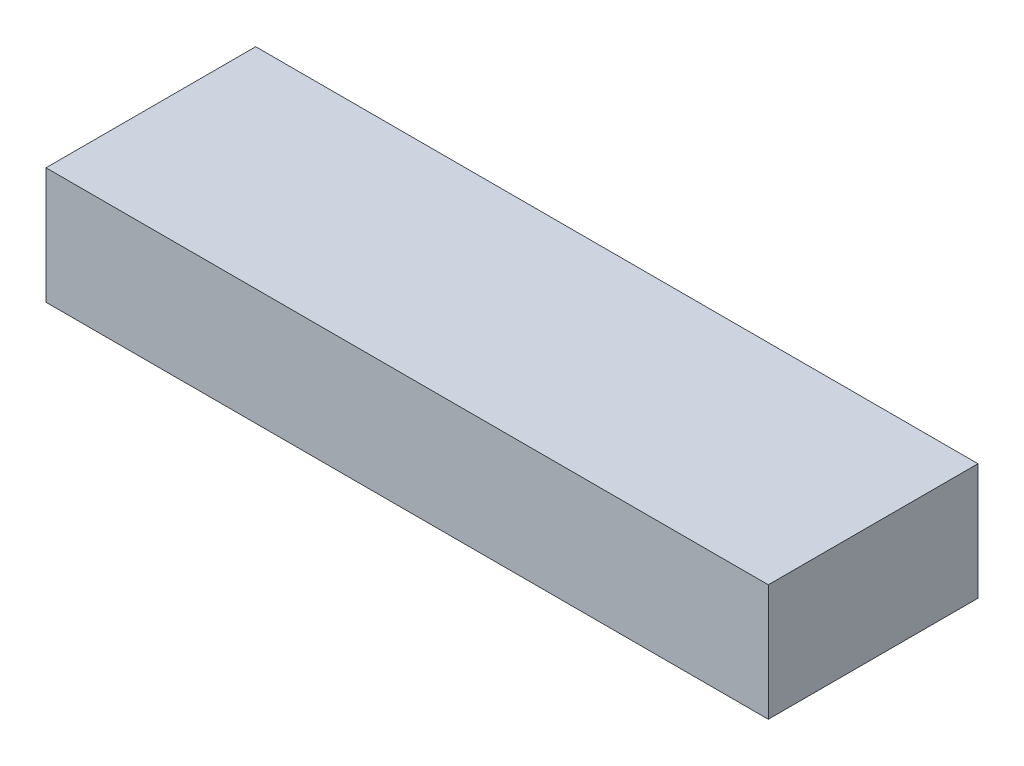
ISO-10303-21;
HEADER;
FILE_DESCRIPTION(('STEP AP214'),'2;1');
FILE_NAME('part.step','',(''),(''),'','','');
FILE_SCHEMA(('AUTOMOTIVE_DESIGN { 1 0 10303 214 1 1 1 1 }'));
ENDSEC;
DATA;
#1=APPLICATION_CONTEXT('core data for automotive mechanical design processes');
#2=APPLICATION_PROTOCOL_DEFINITION('international standard','automotive_design',2000,#1);
#3=PRODUCT_CONTEXT('',#1,'mechanical');
#4=PRODUCT('Part','Part','',(#3));
#5=PRODUCT_RELATED_PRODUCT_CATEGORY('part','',(#4));
#6=PRODUCT_DEFINITION_FORMATION('','',#4);
#7=PRODUCT_DEFINITION_CONTEXT('part definition',#1,'design');
#8=PRODUCT_DEFINITION('design','',#6,#7);
#9=PRODUCT_DEFINITION_SHAPE('','',#8);
#10=(LENGTH_UNIT() NAMED_UNIT(*) SI_UNIT(.MILLI.,.METRE.));
#11=(NAMED_UNIT(*) PLANE_ANGLE_UNIT() SI_UNIT($,.RADIAN.));
#12=(NAMED_UNIT(*) SI_UNIT($,.STERADIAN.) SOLID_ANGLE_UNIT());
#13=UNCERTAINTY_MEASURE_WITH_UNIT(LENGTH_MEASURE(1.E-05),#10,'distance_accuracy_value','');
#14=(GEOMETRIC_REPRESENTATION_CONTEXT(3) GLOBAL_UNCERTAINTY_ASSIGNED_CONTEXT((#13)) GLOBAL_UNIT_ASSIGNED_CONTEXT((#10,
#11,#12)) REPRESENTATION_CONTEXT('',''));
#15=CARTESIAN_POINT('',(0.,0.,0.));
#16=DIRECTION('',(0.,0.,1.));
#17=DIRECTION('',(1.,0.,0.));
#18=AXIS2_PLACEMENT_3D('',#15,#16,#17);
#19=CARTESIAN_POINT('',(77.5,25.,22.5));
#20=DIRECTION('',(-1.,0.,0.));
#21=DIRECTION('',(0.,0.,1.));
#22=AXIS2_PLACEMENT_3D('',#19,#20,#21);
#23=PLANE('',#22);
#24=DIRECTION('',(0.,0.,-1.));
#25=VECTOR('',#24,1.);
#26=CARTESIAN_POINT('',(77.5,0.,22.5));
#27=LINE('',#26,#25);
#28=CARTESIAN_POINT('',(77.5,0.,22.5));
#29=VERTEX_POINT('',#28);
#30=CARTESIAN_POINT('',(77.5,0.,-22.5));
#31=VERTEX_POINT('',#30);
#32=EDGE_CURVE('E106',#29,#31,#27,.T.);
#33=ORIENTED_EDGE('',*,*,#32,.T.);
#34=DIRECTION('',(0.,-1.,0.));
#35=VECTOR('',#34,1.);
#36=CARTESIAN_POINT('',(77.5,25.,-22.5));
#37=LINE('',#36,#35);
#38=CARTESIAN_POINT('',(77.5,25.,-22.5));
#39=VERTEX_POINT('',#38);
#40=EDGE_CURVE('E11',#39,#31,#37,.T.);
#41=ORIENTED_EDGE('',*,*,#40,.F.);
#42=DIRECTION('',(0.,0.,-1.));
#43=VECTOR('',#42,1.);
#44=CARTESIAN_POINT('',(77.5,25.,22.5));
#45=LINE('',#44,#43);
#46=CARTESIAN_POINT('',(77.5,25.,22.5));
#47=VERTEX_POINT('',#46);
#48=EDGE_CURVE('E94',#47,#39,#45,.T.);
#49=ORIENTED_EDGE('',*,*,#48,.F.);
#50=DIRECTION('',(0.,-1.,0.));
#51=VECTOR('',#50,1.);
#52=CARTESIAN_POINT('',(77.5,25.,22.5));
#53=LINE('',#52,#51);
#54=EDGE_CURVE('E102',#47,#29,#53,.T.);
#55=ORIENTED_EDGE('',*,*,#54,.T.);
#56=EDGE_LOOP('',(#33,#41,#49,#55));
#57=FACE_BOUND('',#56,.T.);
#58=ADVANCED_FACE('F43',(#57),#23,.F.);
#59=CARTESIAN_POINT('',(-77.5,25.,-22.5));
#60=DIRECTION('',(0.,0.,1.));
#61=DIRECTION('',(1.,0.,0.));
#62=AXIS2_PLACEMENT_3D('',#59,#60,#61);
#63=PLANE('',#62);
#64=DIRECTION('',(-1.,0.,0.));
#65=VECTOR('',#64,1.);
#66=CARTESIAN_POINT('',(-77.5,0.,-22.5));
#67=LINE('',#66,#65);
#68=CARTESIAN_POINT('',(-77.5,0.,-22.5));
#69=VERTEX_POINT('',#68);
#70=EDGE_CURVE('E98',#31,#69,#67,.T.);
#71=ORIENTED_EDGE('',*,*,#70,.T.);
#72=DIRECTION('',(0.,-1.,0.));
#73=VECTOR('',#72,1.);
#74=CARTESIAN_POINT('',(-77.5,25.,-22.5));
#75=LINE('',#74,#73);
#76=CARTESIAN_POINT('',(-77.5,25.,-22.5));
#77=VERTEX_POINT('',#76);
#78=EDGE_CURVE('E51',#77,#69,#75,.T.);
#79=ORIENTED_EDGE('',*,*,#78,.F.);
#80=DIRECTION('',(-1.,0.,0.));
#81=VECTOR('',#80,1.);
#82=CARTESIAN_POINT('',(-77.5,25.,-22.5));
#83=LINE('',#82,#81);
#84=EDGE_CURVE('E89',#39,#77,#83,.T.);
#85=ORIENTED_EDGE('',*,*,#84,.F.);
#86=ORIENTED_EDGE('',*,*,#40,.T.);
#87=EDGE_LOOP('',(#71,#79,#85,#86));
#88=FACE_BOUND('',#87,.T.);
#89=ADVANCED_FACE('F97',(#88),#63,.F.);
#90=CARTESIAN_POINT('',(-77.5,25.,22.5));
#91=DIRECTION('',(1.,0.,0.));
#92=DIRECTION('',(0.,0.,-1.));
#93=AXIS2_PLACEMENT_3D('',#90,#91,#92);
#94=PLANE('',#93);
#95=DIRECTION('',(0.,0.,1.));
#96=VECTOR('',#95,1.);
#97=CARTESIAN_POINT('',(-77.5,0.,22.5));
#98=LINE('',#97,#96);
#99=CARTESIAN_POINT('',(-77.5,0.,22.5));
#100=VERTEX_POINT('',#99);
#101=EDGE_CURVE('E76',#69,#100,#98,.T.);
#102=ORIENTED_EDGE('',*,*,#101,.T.);
#103=DIRECTION('',(0.,-1.,0.));
#104=VECTOR('',#103,1.);
#105=CARTESIAN_POINT('',(-77.5,25.,22.5));
#106=LINE('',#105,#104);
#107=CARTESIAN_POINT('',(-77.5,25.,22.5));
#108=VERTEX_POINT('',#107);
#109=EDGE_CURVE('E99',#108,#100,#106,.T.);
#110=ORIENTED_EDGE('',*,*,#109,.F.);
#111=DIRECTION('',(0.,0.,1.));
#112=VECTOR('',#111,1.);
#113=CARTESIAN_POINT('',(-77.5,25.,22.5));
#114=LINE('',#113,#112);
#115=EDGE_CURVE('E92',#77,#108,#114,.T.);
#116=ORIENTED_EDGE('',*,*,#115,.F.);
#117=ORIENTED_EDGE('',*,*,#78,.T.);
#118=EDGE_LOOP('',(#102,#110,#116,#117));
#119=FACE_BOUND('',#118,.T.);
#120=ADVANCED_FACE('F100',(#119),#94,.F.);
#121=CARTESIAN_POINT('',(-77.5,25.,22.5));
#122=DIRECTION('',(0.,0.,-1.));
#123=DIRECTION('',(-1.,0.,0.));
#124=AXIS2_PLACEMENT_3D('',#121,#122,#123);
#125=PLANE('',#124);
#126=DIRECTION('',(1.,0.,0.));
#127=VECTOR('',#126,1.);
#128=CARTESIAN_POINT('',(-77.5,0.,22.5));
#129=LINE('',#128,#127);
#130=EDGE_CURVE('E82',#100,#29,#129,.T.);
#131=ORIENTED_EDGE('',*,*,#130,.T.);
#132=ORIENTED_EDGE('',*,*,#54,.F.);
#133=DIRECTION('',(1.,0.,0.));
#134=VECTOR('',#133,1.);
#135=CARTESIAN_POINT('',(-77.5,25.,22.5));
#136=LINE('',#135,#134);
#137=EDGE_CURVE('E59',#108,#47,#136,.T.);
#138=ORIENTED_EDGE('',*,*,#137,.F.);
#139=ORIENTED_EDGE('',*,*,#109,.T.);
#140=EDGE_LOOP('',(#131,#132,#138,#139));
#141=FACE_BOUND('',#140,.T.);
#142=ADVANCED_FACE('F113',(#141),#125,.F.);
#143=CARTESIAN_POINT('',(0.,25.,0.));
#144=DIRECTION('',(0.,-1.,0.));
#145=DIRECTION('',(0.,0.,-1.));
#146=AXIS2_PLACEMENT_3D('',#143,#144,#145);
#147=PLANE('',#146);
#148=ORIENTED_EDGE('',*,*,#48,.T.);
#149=ORIENTED_EDGE('',*,*,#84,.T.);
#150=ORIENTED_EDGE('',*,*,#115,.T.);
#151=ORIENTED_EDGE('',*,*,#137,.T.);
#152=EDGE_LOOP('',(#148,#149,#150,#151));
#153=FACE_BOUND('',#152,.T.);
#154=ADVANCED_FACE('F90',(#153),#147,.F.);
#155=CARTESIAN_POINT('',(0.,0.,0.));
#156=DIRECTION('',(0.,-1.,0.));
#157=DIRECTION('',(0.,0.,-1.));
#158=AXIS2_PLACEMENT_3D('',#155,#156,#157);
#159=PLANE('',#158);
#160=ORIENTED_EDGE('',*,*,#32,.F.);
#161=ORIENTED_EDGE('',*,*,#130,.F.);
#162=ORIENTED_EDGE('',*,*,#101,.F.);
#163=ORIENTED_EDGE('',*,*,#70,.F.);
#164=EDGE_LOOP('',(#160,#161,#162,#163));
#165=FACE_BOUND('',#164,.T.);
#166=ADVANCED_FACE('F116',(#165),#159,.T.);
#167=CLOSED_SHELL('',(#58,#89,#120,#142,#154,#166));
#168=MANIFOLD_SOLID_BREP('B2',#167);
#169=ADVANCED_BREP_SHAPE_REPRESENTATION('',(#18,#168),#14);
#170=SHAPE_DEFINITION_REPRESENTATION(#9,#169);
ENDSEC;
END-ISO-10303-21;
